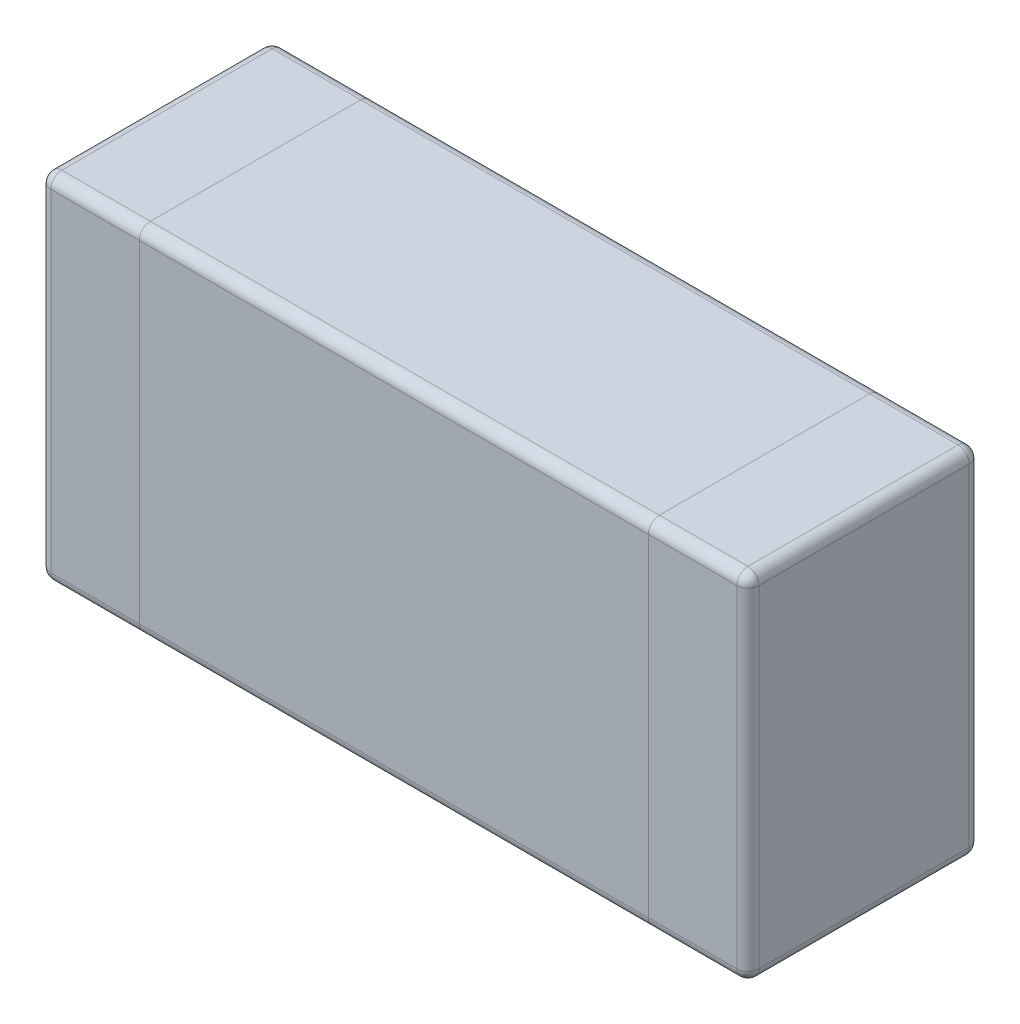
ISO-10303-21;
HEADER;
FILE_DESCRIPTION(('STEP AP214'),'2;1');
FILE_NAME('part.step','',(''),(''),'','','');
FILE_SCHEMA(('AUTOMOTIVE_DESIGN { 1 0 10303 214 1 1 1 1 }'));
ENDSEC;
DATA;
#1=APPLICATION_CONTEXT('core data for automotive mechanical design processes');
#2=APPLICATION_PROTOCOL_DEFINITION('international standard','automotive_design',2000,#1);
#3=PRODUCT_CONTEXT('',#1,'mechanical');
#4=PRODUCT('Part','Part','',(#3));
#5=PRODUCT_RELATED_PRODUCT_CATEGORY('part','',(#4));
#6=PRODUCT_DEFINITION_FORMATION('','',#4);
#7=PRODUCT_DEFINITION_CONTEXT('part definition',#1,'design');
#8=PRODUCT_DEFINITION('design','',#6,#7);
#9=PRODUCT_DEFINITION_SHAPE('','',#8);
#10=(LENGTH_UNIT() NAMED_UNIT(*) SI_UNIT(.MILLI.,.METRE.));
#11=(NAMED_UNIT(*) PLANE_ANGLE_UNIT() SI_UNIT($,.RADIAN.));
#12=(NAMED_UNIT(*) SI_UNIT($,.STERADIAN.) SOLID_ANGLE_UNIT());
#13=UNCERTAINTY_MEASURE_WITH_UNIT(LENGTH_MEASURE(1.E-05),#10,'distance_accuracy_value','');
#14=(GEOMETRIC_REPRESENTATION_CONTEXT(3) GLOBAL_UNCERTAINTY_ASSIGNED_CONTEXT((#13)) GLOBAL_UNIT_ASSIGNED_CONTEXT((#10,
#11,#12)) REPRESENTATION_CONTEXT('',''));
#15=CARTESIAN_POINT('',(0.,0.,0.));
#16=DIRECTION('',(0.,0.,1.));
#17=DIRECTION('',(1.,0.,0.));
#18=AXIS2_PLACEMENT_3D('',#15,#16,#17);
#19=CARTESIAN_POINT('',(1.6,0.799999999999718,1.05000000000022));
#20=DIRECTION('',(0.,2.68736422004423E-13,-1.));
#21=DIRECTION('',(0.,1.,2.68736422004423E-13));
#22=AXIS2_PLACEMENT_3D('',#19,#20,#21);
#23=PLANE('',#22);
#24=DIRECTION('',(0.,-1.,-2.68736422004423E-13));
#25=VECTOR('',#24,1.);
#26=CARTESIAN_POINT('',(-1.15,0.799999999999718,1.05000000000022));
#27=LINE('',#26,#25);
#28=CARTESIAN_POINT('',(-1.15,0.749999999999718,1.0500000000002));
#29=VERTEX_POINT('',#28);
#30=CARTESIAN_POINT('',(-1.15,-0.750000000000283,1.0499999999998));
#31=VERTEX_POINT('',#30);
#32=EDGE_CURVE('E11',#29,#31,#27,.T.);
#33=ORIENTED_EDGE('',*,*,#32,.F.);
#34=DIRECTION('',(-1.,0.,0.));
#35=VECTOR('',#34,1.);
#36=CARTESIAN_POINT('',(1.6,0.749999999999718,1.0500000000002));
#37=LINE('',#36,#35);
#38=CARTESIAN_POINT('',(-1.55,0.749999999999718,1.0500000000002));
#39=VERTEX_POINT('',#38);
#40=EDGE_CURVE('E258',#29,#39,#37,.T.);
#41=ORIENTED_EDGE('',*,*,#40,.T.);
#42=DIRECTION('',(0.,-1.,-2.68736422004423E-13));
#43=VECTOR('',#42,1.);
#44=CARTESIAN_POINT('',(-1.55,0.799999999999718,1.05000000000022));
#45=LINE('',#44,#43);
#46=CARTESIAN_POINT('',(-1.55,-0.750000000000283,1.0499999999998));
#47=VERTEX_POINT('',#46);
#48=EDGE_CURVE('E261',#39,#47,#45,.T.);
#49=ORIENTED_EDGE('',*,*,#48,.T.);
#50=DIRECTION('',(1.,0.,0.));
#51=VECTOR('',#50,1.);
#52=CARTESIAN_POINT('',(1.6,-0.750000000000283,1.0499999999998));
#53=LINE('',#52,#51);
#54=EDGE_CURVE('E265',#47,#31,#53,.T.);
#55=ORIENTED_EDGE('',*,*,#54,.T.);
#56=EDGE_LOOP('',(#33,#41,#49,#55));
#57=FACE_BOUND('',#56,.T.);
#58=ADVANCED_FACE('F42',(#57),#23,.F.);
#59=DIRECTION('',(0.,1.,2.68736422004423E-13));
#60=VECTOR('',#59,1.);
#61=CARTESIAN_POINT('',(1.15,0.799999999999718,1.05000000000022));
#62=LINE('',#61,#60);
#63=CARTESIAN_POINT('',(1.15,-0.750000000000283,1.0499999999998));
#64=VERTEX_POINT('',#63);
#65=CARTESIAN_POINT('',(1.15,0.749999999999718,1.0500000000002));
#66=VERTEX_POINT('',#65);
#67=EDGE_CURVE('E52',#64,#66,#62,.T.);
#68=ORIENTED_EDGE('',*,*,#67,.F.);
#69=CARTESIAN_POINT('',(1.55,-0.750000000000283,1.0499999999998));
#70=VERTEX_POINT('',#69);
#71=EDGE_CURVE('E264',#64,#70,#53,.T.);
#72=ORIENTED_EDGE('',*,*,#71,.T.);
#73=DIRECTION('',(0.,1.,2.68736422004423E-13));
#74=VECTOR('',#73,1.);
#75=CARTESIAN_POINT('',(1.55,0.799999999999718,1.05000000000022));
#76=LINE('',#75,#74);
#77=CARTESIAN_POINT('',(1.55,0.749999999999718,1.0500000000002));
#78=VERTEX_POINT('',#77);
#79=EDGE_CURVE('E255',#70,#78,#76,.T.);
#80=ORIENTED_EDGE('',*,*,#79,.T.);
#81=EDGE_CURVE('E259',#78,#66,#37,.T.);
#82=ORIENTED_EDGE('',*,*,#81,.T.);
#83=EDGE_LOOP('',(#68,#72,#80,#82));
#84=FACE_BOUND('',#83,.T.);
#85=ADVANCED_FACE('F531',(#84),#23,.F.);
#86=CARTESIAN_POINT('',(1.6,-0.750000000000269,0.999999999999799));
#87=DIRECTION('',(1.,0.,0.));
#88=DIRECTION('',(0.,1.,2.68736422004423E-13));
#89=AXIS2_PLACEMENT_3D('',#86,#87,#88);
#90=CYLINDRICAL_SURFACE('',#89,0.05);
#91=DIRECTION('',(1.,0.,0.));
#92=VECTOR('',#91,1.);
#93=CARTESIAN_POINT('',(-1.6,-0.800000000000269,0.999999999999786));
#94=LINE('',#93,#92);
#95=CARTESIAN_POINT('',(-1.15,-0.800000000000269,0.999999999999786));
#96=VERTEX_POINT('',#95);
#97=CARTESIAN_POINT('',(-1.55,-0.800000000000269,0.999999999999786));
#98=VERTEX_POINT('',#97);
#99=EDGE_CURVE('E251',#96,#98,#94,.F.);
#100=ORIENTED_EDGE('',*,*,#99,.F.);
#101=CARTESIAN_POINT('',(-1.15,-0.750000000000269,0.999999999999799));
#102=DIRECTION('',(1.,0.,0.));
#103=DIRECTION('',(0.,1.,2.68736422004423E-13));
#104=AXIS2_PLACEMENT_3D('',#101,#102,#103);
#105=CIRCLE('',#104,0.05);
#106=EDGE_CURVE('E359',#96,#31,#105,.F.);
#107=ORIENTED_EDGE('',*,*,#106,.T.);
#108=ORIENTED_EDGE('',*,*,#54,.F.);
#109=CARTESIAN_POINT('',(-1.55,-0.750000000000269,0.999999999999799));
#110=DIRECTION('',(-1.,0.,0.));
#111=DIRECTION('',(0.,2.68736422004423E-13,-1.));
#112=AXIS2_PLACEMENT_3D('',#109,#110,#111);
#113=CIRCLE('',#112,0.05);
#114=EDGE_CURVE('E335',#47,#98,#113,.F.);
#115=ORIENTED_EDGE('',*,*,#114,.T.);
#116=EDGE_LOOP('',(#100,#107,#108,#115));
#117=FACE_BOUND('',#116,.T.);
#118=ADVANCED_FACE('F488',(#117),#90,.T.);
#119=ORIENTED_EDGE('',*,*,#71,.F.);
#120=CARTESIAN_POINT('',(1.15,-0.750000000000269,0.999999999999799));
#121=DIRECTION('',(-1.,0.,0.));
#122=DIRECTION('',(0.,-1.,-2.68736422004423E-13));
#123=AXIS2_PLACEMENT_3D('',#120,#121,#122);
#124=CIRCLE('',#123,0.05);
#125=CARTESIAN_POINT('',(1.15,-0.800000000000269,0.999999999999786));
#126=VERTEX_POINT('',#125);
#127=EDGE_CURVE('E358',#64,#126,#124,.F.);
#128=ORIENTED_EDGE('',*,*,#127,.T.);
#129=CARTESIAN_POINT('',(1.55,-0.800000000000269,0.999999999999786));
#130=VERTEX_POINT('',#129);
#131=EDGE_CURVE('E252',#130,#126,#94,.F.);
#132=ORIENTED_EDGE('',*,*,#131,.F.);
#133=CARTESIAN_POINT('',(1.55,-0.750000000000269,0.999999999999799));
#134=DIRECTION('',(1.,0.,0.));
#135=DIRECTION('',(0.,1.,2.68736422004423E-13));
#136=AXIS2_PLACEMENT_3D('',#133,#134,#135);
#137=CIRCLE('',#136,0.05);
#138=EDGE_CURVE('E320',#70,#130,#137,.T.);
#139=ORIENTED_EDGE('',*,*,#138,.F.);
#140=EDGE_LOOP('',(#119,#128,#132,#139));
#141=FACE_BOUND('',#140,.T.);
#142=ADVANCED_FACE('F462',(#141),#90,.T.);
#143=CARTESIAN_POINT('',(-1.6,-0.800000000000282,1.04999999999979));
#144=DIRECTION('',(0.,1.,2.68736422004423E-13));
#145=DIRECTION('',(-1.,0.,0.));
#146=AXIS2_PLACEMENT_3D('',#143,#144,#145);
#147=PLANE('',#146);
#148=DIRECTION('',(0.,2.68736422004423E-13,-1.));
#149=VECTOR('',#148,1.);
#150=CARTESIAN_POINT('',(-1.15,-0.800000000000282,1.04999999999979));
#151=LINE('',#150,#149);
#152=CARTESIAN_POINT('',(-1.15,-0.800000000000014,0.0499999999997849));
#153=VERTEX_POINT('',#152);
#154=EDGE_CURVE('E354',#96,#153,#151,.T.);
#155=ORIENTED_EDGE('',*,*,#154,.F.);
#156=ORIENTED_EDGE('',*,*,#99,.T.);
#157=DIRECTION('',(0.,2.68736422004423E-13,-1.));
#158=VECTOR('',#157,1.);
#159=CARTESIAN_POINT('',(-1.55,-0.800000000000282,1.04999999999979));
#160=LINE('',#159,#158);
#161=CARTESIAN_POINT('',(-1.55,-0.800000000000014,0.0499999999997849));
#162=VERTEX_POINT('',#161);
#163=EDGE_CURVE('E248',#98,#162,#160,.T.);
#164=ORIENTED_EDGE('',*,*,#163,.T.);
#165=DIRECTION('',(1.,0.,0.));
#166=VECTOR('',#165,1.);
#167=CARTESIAN_POINT('',(1.6,-0.800000000000014,0.0499999999997849));
#168=LINE('',#167,#166);
#169=EDGE_CURVE('E242',#162,#153,#168,.T.);
#170=ORIENTED_EDGE('',*,*,#169,.T.);
#171=EDGE_LOOP('',(#155,#156,#164,#170));
#172=FACE_BOUND('',#171,.T.);
#173=ADVANCED_FACE('F476',(#172),#147,.F.);
#174=DIRECTION('',(0.,-2.68736422004423E-13,1.));
#175=VECTOR('',#174,1.);
#176=CARTESIAN_POINT('',(1.15,-0.800000000000282,1.04999999999979));
#177=LINE('',#176,#175);
#178=CARTESIAN_POINT('',(1.15,-0.800000000000014,0.0499999999997849));
#179=VERTEX_POINT('',#178);
#180=EDGE_CURVE('E350',#179,#126,#177,.T.);
#181=ORIENTED_EDGE('',*,*,#180,.F.);
#182=CARTESIAN_POINT('',(1.55,-0.800000000000014,0.0499999999997849));
#183=VERTEX_POINT('',#182);
#184=EDGE_CURVE('E241',#179,#183,#168,.T.);
#185=ORIENTED_EDGE('',*,*,#184,.T.);
#186=DIRECTION('',(0.,2.68736422004423E-13,-1.));
#187=VECTOR('',#186,1.);
#188=CARTESIAN_POINT('',(1.55,-0.800000000000282,1.04999999999979));
#189=LINE('',#188,#187);
#190=EDGE_CURVE('E245',#183,#130,#189,.F.);
#191=ORIENTED_EDGE('',*,*,#190,.T.);
#192=ORIENTED_EDGE('',*,*,#131,.T.);
#193=EDGE_LOOP('',(#181,#185,#191,#192));
#194=FACE_BOUND('',#193,.T.);
#195=ADVANCED_FACE('F458',(#194),#147,.F.);
#196=CARTESIAN_POINT('',(-1.6,-0.750000000000014,0.0499999999997984));
#197=DIRECTION('',(-1.,0.,0.));
#198=DIRECTION('',(0.,-1.,-2.68736422004423E-13));
#199=AXIS2_PLACEMENT_3D('',#196,#197,#198);
#200=CYLINDRICAL_SURFACE('',#199,0.05);
#201=DIRECTION('',(1.,0.,0.));
#202=VECTOR('',#201,1.);
#203=CARTESIAN_POINT('',(-1.6,-0.75,-2.01552316503317E-13));
#204=LINE('',#203,#202);
#205=CARTESIAN_POINT('',(-1.15,-0.75,-2.01552316503317E-13));
#206=VERTEX_POINT('',#205);
#207=CARTESIAN_POINT('',(-1.55,-0.75,-2.01552316503317E-13));
#208=VERTEX_POINT('',#207);
#209=EDGE_CURVE('E271',#206,#208,#204,.F.);
#210=ORIENTED_EDGE('',*,*,#209,.F.);
#211=CARTESIAN_POINT('',(-1.15,-0.750000000000014,0.0499999999997984));
#212=DIRECTION('',(1.,0.,0.));
#213=DIRECTION('',(0.,1.,2.68736422004423E-13));
#214=AXIS2_PLACEMENT_3D('',#211,#212,#213);
#215=CIRCLE('',#214,0.05);
#216=EDGE_CURVE('E355',#206,#153,#215,.F.);
#217=ORIENTED_EDGE('',*,*,#216,.T.);
#218=ORIENTED_EDGE('',*,*,#169,.F.);
#219=CARTESIAN_POINT('',(-1.55,-0.750000000000014,0.0499999999997985));
#220=DIRECTION('',(-1.,0.,0.));
#221=DIRECTION('',(0.,-1.,-2.68736422004423E-13));
#222=AXIS2_PLACEMENT_3D('',#219,#220,#221);
#223=CIRCLE('',#222,0.05);
#224=EDGE_CURVE('E326',#162,#208,#223,.F.);
#225=ORIENTED_EDGE('',*,*,#224,.T.);
#226=EDGE_LOOP('',(#210,#217,#218,#225));
#227=FACE_BOUND('',#226,.T.);
#228=ADVANCED_FACE('F514',(#227),#200,.T.);
#229=ORIENTED_EDGE('',*,*,#184,.F.);
#230=CARTESIAN_POINT('',(1.15,-0.750000000000014,0.0499999999997984));
#231=DIRECTION('',(-1.,0.,0.));
#232=DIRECTION('',(0.,-1.,-2.68736422004423E-13));
#233=AXIS2_PLACEMENT_3D('',#230,#231,#232);
#234=CIRCLE('',#233,0.05);
#235=CARTESIAN_POINT('',(1.15,-0.75,-2.01552316503317E-13));
#236=VERTEX_POINT('',#235);
#237=EDGE_CURVE('E370',#179,#236,#234,.F.);
#238=ORIENTED_EDGE('',*,*,#237,.T.);
#239=CARTESIAN_POINT('',(1.55,-0.75,-2.01552316503317E-13));
#240=VERTEX_POINT('',#239);
#241=EDGE_CURVE('E272',#240,#236,#204,.F.);
#242=ORIENTED_EDGE('',*,*,#241,.F.);
#243=CARTESIAN_POINT('',(1.55,-0.750000000000014,0.0499999999997984));
#244=DIRECTION('',(1.,0.,0.));
#245=DIRECTION('',(0.,1.,2.68736422004423E-13));
#246=AXIS2_PLACEMENT_3D('',#243,#244,#245);
#247=CIRCLE('',#246,0.05);
#248=EDGE_CURVE('E306',#183,#240,#247,.T.);
#249=ORIENTED_EDGE('',*,*,#248,.F.);
#250=EDGE_LOOP('',(#229,#238,#242,#249));
#251=FACE_BOUND('',#250,.T.);
#252=ADVANCED_FACE('F448',(#251),#200,.T.);
#253=CARTESIAN_POINT('',(1.6,0.8,2.14989137603538E-13));
#254=DIRECTION('',(0.,2.68736422004423E-13,-1.));
#255=DIRECTION('',(0.,1.,2.68736422004423E-13));
#256=AXIS2_PLACEMENT_3D('',#253,#254,#255);
#257=PLANE('',#256);
#258=DIRECTION('',(-1.,0.,0.));
#259=VECTOR('',#258,1.);
#260=CARTESIAN_POINT('',(1.6,0.75,2.01552316503317E-13));
#261=LINE('',#260,#259);
#262=CARTESIAN_POINT('',(-1.55,0.75,2.01552316503317E-13));
#263=VERTEX_POINT('',#262);
#264=CARTESIAN_POINT('',(-1.15,0.75,2.01552316503317E-13));
#265=VERTEX_POINT('',#264);
#266=EDGE_CURVE('E279',#263,#265,#261,.F.);
#267=ORIENTED_EDGE('',*,*,#266,.T.);
#268=DIRECTION('',(0.,-1.,-2.68736422004423E-13));
#269=VECTOR('',#268,1.);
#270=CARTESIAN_POINT('',(-1.15,0.8,2.14989137603538E-13));
#271=LINE('',#270,#269);
#272=EDGE_CURVE('E371',#265,#206,#271,.T.);
#273=ORIENTED_EDGE('',*,*,#272,.T.);
#274=ORIENTED_EDGE('',*,*,#209,.T.);
#275=DIRECTION('',(0.,-1.,-2.68736422004423E-13));
#276=VECTOR('',#275,1.);
#277=CARTESIAN_POINT('',(-1.55,0.8,2.14989137603538E-13));
#278=LINE('',#277,#276);
#279=EDGE_CURVE('E275',#208,#263,#278,.F.);
#280=ORIENTED_EDGE('',*,*,#279,.T.);
#281=EDGE_LOOP('',(#267,#273,#274,#280));
#282=FACE_BOUND('',#281,.T.);
#283=ADVANCED_FACE('F517',(#282),#257,.T.);
#284=ORIENTED_EDGE('',*,*,#241,.T.);
#285=DIRECTION('',(0.,1.,2.68736422004423E-13));
#286=VECTOR('',#285,1.);
#287=CARTESIAN_POINT('',(1.15,0.8,2.14989137603538E-13));
#288=LINE('',#287,#286);
#289=CARTESIAN_POINT('',(1.15,0.75,2.01552316503317E-13));
#290=VERTEX_POINT('',#289);
#291=EDGE_CURVE('E365',#236,#290,#288,.T.);
#292=ORIENTED_EDGE('',*,*,#291,.T.);
#293=CARTESIAN_POINT('',(1.55,0.75,2.01552316503317E-13));
#294=VERTEX_POINT('',#293);
#295=EDGE_CURVE('E278',#290,#294,#261,.F.);
#296=ORIENTED_EDGE('',*,*,#295,.T.);
#297=DIRECTION('',(0.,1.,2.68736422004423E-13));
#298=VECTOR('',#297,1.);
#299=CARTESIAN_POINT('',(1.55,-0.8,-2.14989137603538E-13));
#300=LINE('',#299,#298);
#301=EDGE_CURVE('E268',#294,#240,#300,.F.);
#302=ORIENTED_EDGE('',*,*,#301,.T.);
#303=EDGE_LOOP('',(#284,#292,#296,#302));
#304=FACE_BOUND('',#303,.T.);
#305=ADVANCED_FACE('F393',(#304),#257,.T.);
#306=CARTESIAN_POINT('',(1.6,0.749999999999731,1.0000000000002));
#307=DIRECTION('',(-1.,0.,0.));
#308=DIRECTION('',(0.,-1.,-2.68736422004423E-13));
#309=AXIS2_PLACEMENT_3D('',#306,#307,#308);
#310=CYLINDRICAL_SURFACE('',#309,0.05);
#311=ORIENTED_EDGE('',*,*,#40,.F.);
#312=CARTESIAN_POINT('',(-1.15,0.749999999999731,1.0000000000002));
#313=DIRECTION('',(1.,0.,0.));
#314=DIRECTION('',(0.,1.,2.68736422004423E-13));
#315=AXIS2_PLACEMENT_3D('',#312,#313,#314);
#316=CIRCLE('',#315,0.05);
#317=CARTESIAN_POINT('',(-1.15,0.799999999999731,1.00000000000022));
#318=VERTEX_POINT('',#317);
#319=EDGE_CURVE('E362',#29,#318,#316,.F.);
#320=ORIENTED_EDGE('',*,*,#319,.T.);
#321=DIRECTION('',(-1.,0.,0.));
#322=VECTOR('',#321,1.);
#323=CARTESIAN_POINT('',(-1.6,0.799999999999731,1.00000000000022));
#324=LINE('',#323,#322);
#325=CARTESIAN_POINT('',(-1.55,0.799999999999731,1.00000000000022));
#326=VERTEX_POINT('',#325);
#327=EDGE_CURVE('E221',#326,#318,#324,.F.);
#328=ORIENTED_EDGE('',*,*,#327,.F.);
#329=CARTESIAN_POINT('',(-1.55,0.749999999999731,1.0000000000002));
#330=DIRECTION('',(-1.,0.,0.));
#331=DIRECTION('',(0.,-1.,-2.68736422004423E-13));
#332=AXIS2_PLACEMENT_3D('',#329,#330,#331);
#333=CIRCLE('',#332,0.05);
#334=EDGE_CURVE('E297',#326,#39,#333,.F.);
#335=ORIENTED_EDGE('',*,*,#334,.T.);
#336=EDGE_LOOP('',(#311,#320,#328,#335));
#337=FACE_BOUND('',#336,.T.);
#338=ADVANCED_FACE('F524',(#337),#310,.T.);
#339=CARTESIAN_POINT('',(1.15,0.799999999999731,1.00000000000022));
#340=VERTEX_POINT('',#339);
#341=CARTESIAN_POINT('',(1.55,0.799999999999731,1.00000000000022));
#342=VERTEX_POINT('',#341);
#343=EDGE_CURVE('E216',#340,#342,#324,.F.);
#344=ORIENTED_EDGE('',*,*,#343,.F.);
#345=CARTESIAN_POINT('',(1.15,0.749999999999731,1.0000000000002));
#346=DIRECTION('',(-1.,0.,0.));
#347=DIRECTION('',(0.,-1.,-2.68736422004423E-13));
#348=AXIS2_PLACEMENT_3D('',#345,#346,#347);
#349=CIRCLE('',#348,0.05);
#350=EDGE_CURVE('E366',#340,#66,#349,.F.);
#351=ORIENTED_EDGE('',*,*,#350,.T.);
#352=ORIENTED_EDGE('',*,*,#81,.F.);
#353=CARTESIAN_POINT('',(1.55,0.749999999999731,1.0000000000002));
#354=DIRECTION('',(1.,0.,0.));
#355=DIRECTION('',(0.,-2.68736422004423E-13,1.));
#356=AXIS2_PLACEMENT_3D('',#353,#354,#355);
#357=CIRCLE('',#356,0.05);
#358=EDGE_CURVE('E201',#342,#78,#357,.T.);
#359=ORIENTED_EDGE('',*,*,#358,.F.);
#360=EDGE_LOOP('',(#344,#351,#352,#359));
#361=FACE_BOUND('',#360,.T.);
#362=ADVANCED_FACE('F427',(#361),#310,.T.);
#363=CARTESIAN_POINT('',(-1.6,0.749999999999987,0.0500000000002015));
#364=DIRECTION('',(1.,0.,0.));
#365=DIRECTION('',(0.,1.,2.68736422004423E-13));
#366=AXIS2_PLACEMENT_3D('',#363,#364,#365);
#367=CYLINDRICAL_SURFACE('',#366,0.05);
#368=DIRECTION('',(-1.,0.,0.));
#369=VECTOR('',#368,1.);
#370=CARTESIAN_POINT('',(-1.6,0.799999999999987,0.0500000000002149));
#371=LINE('',#370,#369);
#372=CARTESIAN_POINT('',(-1.15,0.799999999999987,0.0500000000002149));
#373=VERTEX_POINT('',#372);
#374=CARTESIAN_POINT('',(-1.55,0.799999999999987,0.0500000000002149));
#375=VERTEX_POINT('',#374);
#376=EDGE_CURVE('E213',#373,#375,#371,.T.);
#377=ORIENTED_EDGE('',*,*,#376,.F.);
#378=CARTESIAN_POINT('',(-1.15,0.749999999999987,0.0500000000002015));
#379=DIRECTION('',(1.,0.,0.));
#380=DIRECTION('',(0.,1.,2.68736422004423E-13));
#381=AXIS2_PLACEMENT_3D('',#378,#379,#380);
#382=CIRCLE('',#381,0.05);
#383=EDGE_CURVE('E375',#373,#265,#382,.F.);
#384=ORIENTED_EDGE('',*,*,#383,.T.);
#385=ORIENTED_EDGE('',*,*,#266,.F.);
#386=CARTESIAN_POINT('',(-1.55,0.749999999999987,0.0500000000002015));
#387=DIRECTION('',(-1.,0.,0.));
#388=DIRECTION('',(0.,-1.,-2.68736422004423E-13));
#389=AXIS2_PLACEMENT_3D('',#386,#387,#388);
#390=CIRCLE('',#389,0.05);
#391=EDGE_CURVE('E294',#263,#375,#390,.F.);
#392=ORIENTED_EDGE('',*,*,#391,.T.);
#393=EDGE_LOOP('',(#377,#384,#385,#392));
#394=FACE_BOUND('',#393,.T.);
#395=ADVANCED_FACE('F410',(#394),#367,.T.);
#396=ORIENTED_EDGE('',*,*,#295,.F.);
#397=CARTESIAN_POINT('',(1.15,0.749999999999987,0.0500000000002015));
#398=DIRECTION('',(-1.,0.,0.));
#399=DIRECTION('',(0.,-1.,-2.68736422004423E-13));
#400=AXIS2_PLACEMENT_3D('',#397,#398,#399);
#401=CIRCLE('',#400,0.05);
#402=CARTESIAN_POINT('',(1.15,0.799999999999987,0.0500000000002149));
#403=VERTEX_POINT('',#402);
#404=EDGE_CURVE('E46',#290,#403,#401,.F.);
#405=ORIENTED_EDGE('',*,*,#404,.T.);
#406=CARTESIAN_POINT('',(1.55,0.799999999999987,0.0500000000002149));
#407=VERTEX_POINT('',#406);
#408=EDGE_CURVE('E204',#407,#403,#371,.T.);
#409=ORIENTED_EDGE('',*,*,#408,.F.);
#410=CARTESIAN_POINT('',(1.55,0.749999999999987,0.0500000000002016));
#411=DIRECTION('',(1.,0.,0.));
#412=DIRECTION('',(0.,1.,2.68736422004423E-13));
#413=AXIS2_PLACEMENT_3D('',#410,#411,#412);
#414=CIRCLE('',#413,0.05);
#415=EDGE_CURVE('E193',#294,#407,#414,.T.);
#416=ORIENTED_EDGE('',*,*,#415,.F.);
#417=EDGE_LOOP('',(#396,#405,#409,#416));
#418=FACE_BOUND('',#417,.T.);
#419=ADVANCED_FACE('F205',(#418),#367,.T.);
#420=CARTESIAN_POINT('',(-1.6,0.799999999999718,1.05000000000022));
#421=DIRECTION('',(0.,-1.,-2.68736422004423E-13));
#422=DIRECTION('',(1.,0.,0.));
#423=AXIS2_PLACEMENT_3D('',#420,#421,#422);
#424=PLANE('',#423);
#425=DIRECTION('',(0.,-2.68736422004423E-13,1.));
#426=VECTOR('',#425,1.);
#427=CARTESIAN_POINT('',(-1.15,0.799999999999718,1.05000000000022));
#428=LINE('',#427,#426);
#429=EDGE_CURVE('E346',#373,#318,#428,.T.);
#430=ORIENTED_EDGE('',*,*,#429,.F.);
#431=ORIENTED_EDGE('',*,*,#376,.T.);
#432=DIRECTION('',(0.,2.68736422004423E-13,-1.));
#433=VECTOR('',#432,1.);
#434=CARTESIAN_POINT('',(-1.55,0.799999999999718,1.05000000000022));
#435=LINE('',#434,#433);
#436=EDGE_CURVE('E210',#375,#326,#435,.F.);
#437=ORIENTED_EDGE('',*,*,#436,.T.);
#438=ORIENTED_EDGE('',*,*,#327,.T.);
#439=EDGE_LOOP('',(#430,#431,#437,#438));
#440=FACE_BOUND('',#439,.T.);
#441=ADVANCED_FACE('F413',(#440),#424,.F.);
#442=DIRECTION('',(0.,2.68736422004423E-13,-1.));
#443=VECTOR('',#442,1.);
#444=CARTESIAN_POINT('',(1.15,0.799999999999718,1.05000000000022));
#445=LINE('',#444,#443);
#446=EDGE_CURVE('E281',#340,#403,#445,.T.);
#447=ORIENTED_EDGE('',*,*,#446,.F.);
#448=ORIENTED_EDGE('',*,*,#343,.T.);
#449=DIRECTION('',(0.,2.68736422004423E-13,-1.));
#450=VECTOR('',#449,1.);
#451=CARTESIAN_POINT('',(1.55,0.799999999999718,1.05000000000022));
#452=LINE('',#451,#450);
#453=EDGE_CURVE('E185',#342,#407,#452,.T.);
#454=ORIENTED_EDGE('',*,*,#453,.T.);
#455=ORIENTED_EDGE('',*,*,#408,.T.);
#456=EDGE_LOOP('',(#447,#448,#454,#455));
#457=FACE_BOUND('',#456,.T.);
#458=ADVANCED_FACE('F214',(#457),#424,.F.);
#459=CARTESIAN_POINT('',(1.6,-0.800000000000282,1.04999999999979));
#460=DIRECTION('',(-1.,0.,0.));
#461=DIRECTION('',(0.,-1.,-2.68736422004423E-13));
#462=AXIS2_PLACEMENT_3D('',#459,#460,#461);
#463=PLANE('',#462);
#464=DIRECTION('',(0.,2.68736422004423E-13,-1.));
#465=VECTOR('',#464,1.);
#466=CARTESIAN_POINT('',(1.6,0.749999999999718,1.0500000000002));
#467=LINE('',#466,#465);
#468=CARTESIAN_POINT('',(1.6,0.749999999999987,0.0500000000002015));
#469=VERTEX_POINT('',#468);
#470=CARTESIAN_POINT('',(1.6,0.749999999999731,1.0000000000002));
#471=VERTEX_POINT('',#470);
#472=EDGE_CURVE('E187',#469,#471,#467,.F.);
#473=ORIENTED_EDGE('',*,*,#472,.T.);
#474=DIRECTION('',(0.,1.,2.68736422004423E-13));
#475=VECTOR('',#474,1.);
#476=CARTESIAN_POINT('',(1.6,-0.800000000000269,0.999999999999786));
#477=LINE('',#476,#475);
#478=CARTESIAN_POINT('',(1.6,-0.750000000000269,0.999999999999799));
#479=VERTEX_POINT('',#478);
#480=EDGE_CURVE('E230',#471,#479,#477,.F.);
#481=ORIENTED_EDGE('',*,*,#480,.T.);
#482=DIRECTION('',(0.,2.68736422004423E-13,-1.));
#483=VECTOR('',#482,1.);
#484=CARTESIAN_POINT('',(1.6,-0.750000000000282,1.0499999999998));
#485=LINE('',#484,#483);
#486=CARTESIAN_POINT('',(1.6,-0.750000000000014,0.0499999999997984));
#487=VERTEX_POINT('',#486);
#488=EDGE_CURVE('E227',#479,#487,#485,.T.);
#489=ORIENTED_EDGE('',*,*,#488,.T.);
#490=DIRECTION('',(0.,1.,2.68736422004423E-13));
#491=VECTOR('',#490,1.);
#492=CARTESIAN_POINT('',(1.6,0.799999999999987,0.0500000000002149));
#493=LINE('',#492,#491);
#494=EDGE_CURVE('E225',#487,#469,#493,.T.);
#495=ORIENTED_EDGE('',*,*,#494,.T.);
#496=EDGE_LOOP('',(#473,#481,#489,#495));
#497=FACE_BOUND('',#496,.T.);
#498=ADVANCED_FACE('F439',(#497),#463,.F.);
#499=EDGE_CURVE('E211',#403,#373,#371,.T.);
#500=ORIENTED_EDGE('',*,*,#499,.T.);
#501=ORIENTED_EDGE('',*,*,#429,.T.);
#502=EDGE_CURVE('E219',#318,#340,#324,.F.);
#503=ORIENTED_EDGE('',*,*,#502,.T.);
#504=ORIENTED_EDGE('',*,*,#446,.T.);
#505=EDGE_LOOP('',(#500,#501,#503,#504));
#506=FACE_BOUND('',#505,.T.);
#507=ADVANCED_FACE('F419',(#506),#424,.F.);
#508=CARTESIAN_POINT('',(-1.6,-0.800000000000282,1.04999999999979));
#509=DIRECTION('',(1.,0.,0.));
#510=DIRECTION('',(0.,1.,2.68736422004423E-13));
#511=AXIS2_PLACEMENT_3D('',#508,#509,#510);
#512=PLANE('',#511);
#513=DIRECTION('',(0.,2.68736422004423E-13,-1.));
#514=VECTOR('',#513,1.);
#515=CARTESIAN_POINT('',(-1.6,-0.750000000000282,1.0499999999998));
#516=LINE('',#515,#514);
#517=CARTESIAN_POINT('',(-1.6,-0.750000000000014,0.0499999999997984));
#518=VERTEX_POINT('',#517);
#519=CARTESIAN_POINT('',(-1.6,-0.750000000000269,0.999999999999799));
#520=VERTEX_POINT('',#519);
#521=EDGE_CURVE('E234',#518,#520,#516,.F.);
#522=ORIENTED_EDGE('',*,*,#521,.T.);
#523=DIRECTION('',(0.,-1.,-2.68736422004423E-13));
#524=VECTOR('',#523,1.);
#525=CARTESIAN_POINT('',(-1.6,-0.800000000000269,0.999999999999786));
#526=LINE('',#525,#524);
#527=CARTESIAN_POINT('',(-1.6,0.749999999999732,1.0000000000002));
#528=VERTEX_POINT('',#527);
#529=EDGE_CURVE('E239',#520,#528,#526,.F.);
#530=ORIENTED_EDGE('',*,*,#529,.T.);
#531=DIRECTION('',(0.,2.68736422004423E-13,-1.));
#532=VECTOR('',#531,1.);
#533=CARTESIAN_POINT('',(-1.6,0.749999999999718,1.0500000000002));
#534=LINE('',#533,#532);
#535=CARTESIAN_POINT('',(-1.6,0.749999999999987,0.0500000000002015));
#536=VERTEX_POINT('',#535);
#537=EDGE_CURVE('E236',#528,#536,#534,.T.);
#538=ORIENTED_EDGE('',*,*,#537,.T.);
#539=DIRECTION('',(0.,-1.,-2.68736422004423E-13));
#540=VECTOR('',#539,1.);
#541=CARTESIAN_POINT('',(-1.6,-0.800000000000014,0.0499999999997849));
#542=LINE('',#541,#540);
#543=EDGE_CURVE('E232',#536,#518,#542,.T.);
#544=ORIENTED_EDGE('',*,*,#543,.T.);
#545=EDGE_LOOP('',(#522,#530,#538,#544));
#546=FACE_BOUND('',#545,.T.);
#547=ADVANCED_FACE('F496',(#546),#512,.F.);
#548=EDGE_CURVE('E256',#126,#96,#94,.F.);
#549=ORIENTED_EDGE('',*,*,#548,.T.);
#550=ORIENTED_EDGE('',*,*,#154,.T.);
#551=EDGE_CURVE('E246',#153,#179,#168,.T.);
#552=ORIENTED_EDGE('',*,*,#551,.T.);
#553=ORIENTED_EDGE('',*,*,#180,.T.);
#554=EDGE_LOOP('',(#549,#550,#552,#553));
#555=FACE_BOUND('',#554,.T.);
#556=ADVANCED_FACE('F469',(#555),#147,.F.);
#557=EDGE_CURVE('E262',#66,#29,#37,.T.);
#558=ORIENTED_EDGE('',*,*,#557,.T.);
#559=ORIENTED_EDGE('',*,*,#32,.T.);
#560=EDGE_CURVE('E269',#31,#64,#53,.T.);
#561=ORIENTED_EDGE('',*,*,#560,.T.);
#562=ORIENTED_EDGE('',*,*,#67,.T.);
#563=EDGE_LOOP('',(#558,#559,#561,#562));
#564=FACE_BOUND('',#563,.T.);
#565=ADVANCED_FACE('F529',(#564),#23,.F.);
#566=ORIENTED_EDGE('',*,*,#272,.F.);
#567=EDGE_CURVE('E282',#265,#290,#261,.F.);
#568=ORIENTED_EDGE('',*,*,#567,.T.);
#569=ORIENTED_EDGE('',*,*,#291,.F.);
#570=EDGE_CURVE('E276',#236,#206,#204,.F.);
#571=ORIENTED_EDGE('',*,*,#570,.T.);
#572=EDGE_LOOP('',(#566,#568,#569,#571));
#573=FACE_BOUND('',#572,.T.);
#574=ADVANCED_FACE('F404',(#573),#257,.T.);
#575=CARTESIAN_POINT('',(-1.55,-0.750000000000282,1.0499999999998));
#576=DIRECTION('',(0.,2.68736422004423E-13,-1.));
#577=DIRECTION('',(0.,1.,2.68736422004423E-13));
#578=AXIS2_PLACEMENT_3D('',#575,#576,#577);
#579=CYLINDRICAL_SURFACE('',#578,0.05);
#580=CARTESIAN_POINT('',(-1.55,-0.750000000000269,0.999999999999799));
#581=DIRECTION('',(0.,-2.68736422004423E-13,1.));
#582=DIRECTION('',(0.,-1.,-2.68736422004423E-13));
#583=AXIS2_PLACEMENT_3D('',#580,#581,#582);
#584=CIRCLE('',#583,0.05);
#585=EDGE_CURVE('E341',#520,#98,#584,.T.);
#586=ORIENTED_EDGE('',*,*,#585,.F.);
#587=ORIENTED_EDGE('',*,*,#521,.F.);
#588=CARTESIAN_POINT('',(-1.55,-0.750000000000014,0.0499999999997984));
#589=DIRECTION('',(0.,2.68736422004423E-13,-1.));
#590=DIRECTION('',(0.,1.,2.68736422004423E-13));
#591=AXIS2_PLACEMENT_3D('',#588,#589,#590);
#592=CIRCLE('',#591,0.05);
#593=EDGE_CURVE('E338',#162,#518,#592,.T.);
#594=ORIENTED_EDGE('',*,*,#593,.F.);
#595=ORIENTED_EDGE('',*,*,#163,.F.);
#596=EDGE_LOOP('',(#586,#587,#594,#595));
#597=FACE_BOUND('',#596,.T.);
#598=ADVANCED_FACE('F44',(#597),#579,.T.);
#599=CARTESIAN_POINT('',(-1.55,-0.750000000000269,0.999999999999799));
#600=DIRECTION('',(0.,-1.,-2.68736422004423E-13));
#601=DIRECTION('',(1.,0.,0.));
#602=AXIS2_PLACEMENT_3D('',#599,#600,#601);
#603=SPHERICAL_SURFACE('',#602,0.05);
#604=CARTESIAN_POINT('',(-1.55,-0.750000000000269,0.999999999999799));
#605=DIRECTION('',(0.,-1.,-2.68736422004423E-13));
#606=DIRECTION('',(1.,0.,0.));
#607=AXIS2_PLACEMENT_3D('',#604,#605,#606);
#608=CIRCLE('',#607,0.05);
#609=EDGE_CURVE('E332',#520,#47,#608,.F.);
#610=ORIENTED_EDGE('',*,*,#609,.F.);
#611=ORIENTED_EDGE('',*,*,#585,.T.);
#612=ORIENTED_EDGE('',*,*,#114,.F.);
#613=EDGE_LOOP('',(#610,#611,#612));
#614=FACE_BOUND('',#613,.T.);
#615=ADVANCED_FACE('F485',(#614),#603,.T.);
#616=CARTESIAN_POINT('',(-1.55,-0.750000000000014,0.0499999999997985));
#617=DIRECTION('',(0.,-1.,-2.68736422004423E-13));
#618=DIRECTION('',(1.,0.,0.));
#619=AXIS2_PLACEMENT_3D('',#616,#617,#618);
#620=SPHERICAL_SURFACE('',#619,0.05);
#621=ORIENTED_EDGE('',*,*,#224,.F.);
#622=ORIENTED_EDGE('',*,*,#593,.T.);
#623=CARTESIAN_POINT('',(-1.55,-0.750000000000014,0.0499999999997984));
#624=DIRECTION('',(0.,-1.,-2.68736422004423E-13));
#625=DIRECTION('',(1.,0.,0.));
#626=AXIS2_PLACEMENT_3D('',#623,#624,#625);
#627=CIRCLE('',#626,0.05);
#628=EDGE_CURVE('E329',#208,#518,#627,.F.);
#629=ORIENTED_EDGE('',*,*,#628,.F.);
#630=EDGE_LOOP('',(#621,#622,#629));
#631=FACE_BOUND('',#630,.T.);
#632=ADVANCED_FACE('F512',(#631),#620,.T.);
#633=ORIENTED_EDGE('',*,*,#106,.F.);
#634=ORIENTED_EDGE('',*,*,#548,.F.);
#635=ORIENTED_EDGE('',*,*,#127,.F.);
#636=ORIENTED_EDGE('',*,*,#560,.F.);
#637=EDGE_LOOP('',(#633,#634,#635,#636));
#638=FACE_BOUND('',#637,.T.);
#639=ADVANCED_FACE('F471',(#638),#90,.T.);
#640=CARTESIAN_POINT('',(-1.55,0.799999999999731,1.00000000000022));
#641=DIRECTION('',(0.,-1.,-2.68736422004423E-13));
#642=DIRECTION('',(1.,0.,0.));
#643=AXIS2_PLACEMENT_3D('',#640,#641,#642);
#644=CYLINDRICAL_SURFACE('',#643,0.05);
#645=ORIENTED_EDGE('',*,*,#609,.T.);
#646=ORIENTED_EDGE('',*,*,#48,.F.);
#647=CARTESIAN_POINT('',(-1.55,0.749999999999732,1.0000000000002));
#648=DIRECTION('',(0.,1.,2.70904826349394E-13));
#649=DIRECTION('',(0.,-2.70904826349394E-13,1.));
#650=AXIS2_PLACEMENT_3D('',#647,#648,#649);
#651=CIRCLE('',#650,0.05);
#652=EDGE_CURVE('E317',#528,#39,#651,.T.);
#653=ORIENTED_EDGE('',*,*,#652,.F.);
#654=ORIENTED_EDGE('',*,*,#529,.F.);
#655=EDGE_LOOP('',(#645,#646,#653,#654));
#656=FACE_BOUND('',#655,.T.);
#657=ADVANCED_FACE('F493',(#656),#644,.T.);
#658=CARTESIAN_POINT('',(-1.55,0.749999999999718,1.0500000000002));
#659=DIRECTION('',(0.,2.68736422004423E-13,-1.));
#660=DIRECTION('',(0.,1.,2.68736422004423E-13));
#661=AXIS2_PLACEMENT_3D('',#658,#659,#660);
#662=CYLINDRICAL_SURFACE('',#661,0.05);
#663=CARTESIAN_POINT('',(-1.55,0.749999999999987,0.0500000000002015));
#664=DIRECTION('',(0.,2.68736422004423E-13,-1.));
#665=DIRECTION('',(0.,1.,2.68736422004423E-13));
#666=AXIS2_PLACEMENT_3D('',#663,#664,#665);
#667=CIRCLE('',#666,0.05);
#668=EDGE_CURVE('E311',#536,#375,#667,.T.);
#669=ORIENTED_EDGE('',*,*,#668,.F.);
#670=ORIENTED_EDGE('',*,*,#537,.F.);
#671=CARTESIAN_POINT('',(-1.55,0.749999999999731,1.0000000000002));
#672=DIRECTION('',(0.,-2.68736422004423E-13,1.));
#673=DIRECTION('',(0.,-1.,-2.68736422004423E-13));
#674=AXIS2_PLACEMENT_3D('',#671,#672,#673);
#675=CIRCLE('',#674,0.05);
#676=EDGE_CURVE('E314',#326,#528,#675,.T.);
#677=ORIENTED_EDGE('',*,*,#676,.F.);
#678=ORIENTED_EDGE('',*,*,#436,.F.);
#679=EDGE_LOOP('',(#669,#670,#677,#678));
#680=FACE_BOUND('',#679,.T.);
#681=ADVANCED_FACE('F500',(#680),#662,.T.);
#682=CARTESIAN_POINT('',(-1.55,-0.800000000000014,0.0499999999997849));
#683=DIRECTION('',(0.,1.,2.68736422004423E-13));
#684=DIRECTION('',(-1.,0.,0.));
#685=AXIS2_PLACEMENT_3D('',#682,#683,#684);
#686=CYLINDRICAL_SURFACE('',#685,0.05);
#687=ORIENTED_EDGE('',*,*,#628,.T.);
#688=ORIENTED_EDGE('',*,*,#543,.F.);
#689=CARTESIAN_POINT('',(-1.55,0.749999999999987,0.0500000000002016));
#690=DIRECTION('',(0.,1.,2.68736422004423E-13));
#691=DIRECTION('',(-1.,0.,0.));
#692=AXIS2_PLACEMENT_3D('',#689,#690,#691);
#693=CIRCLE('',#692,0.05);
#694=EDGE_CURVE('E309',#263,#536,#693,.T.);
#695=ORIENTED_EDGE('',*,*,#694,.F.);
#696=ORIENTED_EDGE('',*,*,#279,.F.);
#697=EDGE_LOOP('',(#687,#688,#695,#696));
#698=FACE_BOUND('',#697,.T.);
#699=ADVANCED_FACE('F507',(#698),#686,.T.);
#700=ORIENTED_EDGE('',*,*,#216,.F.);
#701=ORIENTED_EDGE('',*,*,#570,.F.);
#702=ORIENTED_EDGE('',*,*,#237,.F.);
#703=ORIENTED_EDGE('',*,*,#551,.F.);
#704=EDGE_LOOP('',(#700,#701,#702,#703));
#705=FACE_BOUND('',#704,.T.);
#706=ADVANCED_FACE('F516',(#705),#200,.T.);
#707=CARTESIAN_POINT('',(1.55,-0.750000000000282,1.0499999999998));
#708=DIRECTION('',(0.,2.68736422004423E-13,-1.));
#709=DIRECTION('',(0.,1.,2.68736422004423E-13));
#710=AXIS2_PLACEMENT_3D('',#707,#708,#709);
#711=CYLINDRICAL_SURFACE('',#710,0.05);
#712=CARTESIAN_POINT('',(1.55,-0.750000000000269,0.999999999999799));
#713=DIRECTION('',(0.,-2.68736422004423E-13,1.));
#714=DIRECTION('',(0.,-1.,-2.68736422004423E-13));
#715=AXIS2_PLACEMENT_3D('',#712,#713,#714);
#716=CIRCLE('',#715,0.05);
#717=EDGE_CURVE('E323',#130,#479,#716,.T.);
#718=ORIENTED_EDGE('',*,*,#717,.F.);
#719=ORIENTED_EDGE('',*,*,#190,.F.);
#720=CARTESIAN_POINT('',(1.55,-0.750000000000014,0.0499999999997984));
#721=DIRECTION('',(0.,2.68736422004423E-13,-1.));
#722=DIRECTION('',(0.,1.,2.68736422004423E-13));
#723=AXIS2_PLACEMENT_3D('',#720,#721,#722);
#724=CIRCLE('',#723,0.05);
#725=EDGE_CURVE('E303',#487,#183,#724,.T.);
#726=ORIENTED_EDGE('',*,*,#725,.F.);
#727=ORIENTED_EDGE('',*,*,#488,.F.);
#728=EDGE_LOOP('',(#718,#719,#726,#727));
#729=FACE_BOUND('',#728,.T.);
#730=ADVANCED_FACE('F455',(#729),#711,.T.);
#731=CARTESIAN_POINT('',(1.55,-0.750000000000269,0.999999999999799));
#732=DIRECTION('',(0.,-1.,-2.68736422004423E-13));
#733=DIRECTION('',(1.,0.,0.));
#734=AXIS2_PLACEMENT_3D('',#731,#732,#733);
#735=SPHERICAL_SURFACE('',#734,0.05);
#736=ORIENTED_EDGE('',*,*,#138,.T.);
#737=ORIENTED_EDGE('',*,*,#717,.T.);
#738=CARTESIAN_POINT('',(1.55,-0.750000000000269,0.999999999999799));
#739=DIRECTION('',(0.,-1.,-2.70904826349394E-13));
#740=DIRECTION('',(0.,2.70904826349394E-13,-1.));
#741=AXIS2_PLACEMENT_3D('',#738,#739,#740);
#742=CIRCLE('',#741,0.05);
#743=EDGE_CURVE('E300',#70,#479,#742,.F.);
#744=ORIENTED_EDGE('',*,*,#743,.F.);
#745=EDGE_LOOP('',(#736,#737,#744));
#746=FACE_BOUND('',#745,.T.);
#747=ADVANCED_FACE('F540',(#746),#735,.T.);
#748=CARTESIAN_POINT('',(-1.55,0.749999999999731,1.0000000000002));
#749=DIRECTION('',(0.,-1.,-2.68736422004423E-13));
#750=DIRECTION('',(1.,0.,0.));
#751=AXIS2_PLACEMENT_3D('',#748,#749,#750);
#752=SPHERICAL_SURFACE('',#751,0.05);
#753=ORIENTED_EDGE('',*,*,#676,.T.);
#754=ORIENTED_EDGE('',*,*,#652,.T.);
#755=ORIENTED_EDGE('',*,*,#334,.F.);
#756=EDGE_LOOP('',(#753,#754,#755));
#757=FACE_BOUND('',#756,.T.);
#758=ADVANCED_FACE('F542',(#757),#752,.T.);
#759=CARTESIAN_POINT('',(-1.55,0.749999999999987,0.0500000000002016));
#760=DIRECTION('',(0.,-1.,-2.68736422004423E-13));
#761=DIRECTION('',(1.,0.,0.));
#762=AXIS2_PLACEMENT_3D('',#759,#760,#761);
#763=SPHERICAL_SURFACE('',#762,0.05);
#764=ORIENTED_EDGE('',*,*,#694,.T.);
#765=ORIENTED_EDGE('',*,*,#668,.T.);
#766=ORIENTED_EDGE('',*,*,#391,.F.);
#767=EDGE_LOOP('',(#764,#765,#766));
#768=FACE_BOUND('',#767,.T.);
#769=ADVANCED_FACE('F548',(#768),#763,.T.);
#770=CARTESIAN_POINT('',(1.55,-0.750000000000014,0.0499999999997985));
#771=DIRECTION('',(0.,-1.,-2.68736422004423E-13));
#772=DIRECTION('',(1.,0.,0.));
#773=AXIS2_PLACEMENT_3D('',#770,#771,#772);
#774=SPHERICAL_SURFACE('',#773,0.05);
#775=ORIENTED_EDGE('',*,*,#725,.T.);
#776=ORIENTED_EDGE('',*,*,#248,.T.);
#777=CARTESIAN_POINT('',(1.55,-0.750000000000014,0.0499999999997985));
#778=DIRECTION('',(0.,-1.,-2.68736422004423E-13));
#779=DIRECTION('',(1.,0.,0.));
#780=AXIS2_PLACEMENT_3D('',#777,#778,#779);
#781=CIRCLE('',#780,0.05);
#782=EDGE_CURVE('E291',#487,#240,#781,.F.);
#783=ORIENTED_EDGE('',*,*,#782,.F.);
#784=EDGE_LOOP('',(#775,#776,#783));
#785=FACE_BOUND('',#784,.T.);
#786=ADVANCED_FACE('F451',(#785),#774,.T.);
#787=CARTESIAN_POINT('',(1.55,0.799999999999731,1.00000000000022));
#788=DIRECTION('',(0.,1.,2.68736422004423E-13));
#789=DIRECTION('',(-1.,0.,0.));
#790=AXIS2_PLACEMENT_3D('',#787,#788,#789);
#791=CYLINDRICAL_SURFACE('',#790,0.05);
#792=ORIENTED_EDGE('',*,*,#743,.T.);
#793=ORIENTED_EDGE('',*,*,#480,.F.);
#794=CARTESIAN_POINT('',(1.55,0.749999999999731,1.0000000000002));
#795=DIRECTION('',(0.,1.,2.68736422004423E-13));
#796=DIRECTION('',(-1.,0.,0.));
#797=AXIS2_PLACEMENT_3D('',#794,#795,#796);
#798=CIRCLE('',#797,0.05);
#799=EDGE_CURVE('E288',#78,#471,#798,.T.);
#800=ORIENTED_EDGE('',*,*,#799,.F.);
#801=ORIENTED_EDGE('',*,*,#79,.F.);
#802=EDGE_LOOP('',(#792,#793,#800,#801));
#803=FACE_BOUND('',#802,.T.);
#804=ADVANCED_FACE('F435',(#803),#791,.T.);
#805=ORIENTED_EDGE('',*,*,#319,.F.);
#806=ORIENTED_EDGE('',*,*,#557,.F.);
#807=ORIENTED_EDGE('',*,*,#350,.F.);
#808=ORIENTED_EDGE('',*,*,#502,.F.);
#809=EDGE_LOOP('',(#805,#806,#807,#808));
#810=FACE_BOUND('',#809,.T.);
#811=ADVANCED_FACE('F422',(#810),#310,.T.);
#812=ORIENTED_EDGE('',*,*,#383,.F.);
#813=ORIENTED_EDGE('',*,*,#499,.F.);
#814=ORIENTED_EDGE('',*,*,#404,.F.);
#815=ORIENTED_EDGE('',*,*,#567,.F.);
#816=EDGE_LOOP('',(#812,#813,#814,#815));
#817=FACE_BOUND('',#816,.T.);
#818=ADVANCED_FACE('F402',(#817),#367,.T.);
#819=CARTESIAN_POINT('',(1.55,-0.800000000000014,0.0499999999997849));
#820=DIRECTION('',(0.,-1.,-2.68736422004423E-13));
#821=DIRECTION('',(1.,0.,0.));
#822=AXIS2_PLACEMENT_3D('',#819,#820,#821);
#823=CYLINDRICAL_SURFACE('',#822,0.05);
#824=ORIENTED_EDGE('',*,*,#782,.T.);
#825=ORIENTED_EDGE('',*,*,#301,.F.);
#826=CARTESIAN_POINT('',(1.55,0.749999999999987,0.0500000000002015));
#827=DIRECTION('',(0.,1.,2.68736422004423E-13));
#828=DIRECTION('',(-1.,0.,0.));
#829=AXIS2_PLACEMENT_3D('',#826,#827,#828);
#830=CIRCLE('',#829,0.05);
#831=EDGE_CURVE('E197',#469,#294,#830,.T.);
#832=ORIENTED_EDGE('',*,*,#831,.F.);
#833=ORIENTED_EDGE('',*,*,#494,.F.);
#834=EDGE_LOOP('',(#824,#825,#832,#833));
#835=FACE_BOUND('',#834,.T.);
#836=ADVANCED_FACE('F443',(#835),#823,.T.);
#837=CARTESIAN_POINT('',(1.55,0.749999999999731,1.0000000000002));
#838=DIRECTION('',(0.,-1.,-2.68736422004423E-13));
#839=DIRECTION('',(1.,0.,0.));
#840=AXIS2_PLACEMENT_3D('',#837,#838,#839);
#841=SPHERICAL_SURFACE('',#840,0.05);
#842=ORIENTED_EDGE('',*,*,#358,.T.);
#843=ORIENTED_EDGE('',*,*,#799,.T.);
#844=CARTESIAN_POINT('',(1.55,0.749999999999731,1.0000000000002));
#845=DIRECTION('',(0.,-2.68736422004423E-13,1.));
#846=DIRECTION('',(0.,-1.,-2.68736422004423E-13));
#847=AXIS2_PLACEMENT_3D('',#844,#845,#846);
#848=CIRCLE('',#847,0.05);
#849=EDGE_CURVE('E190',#342,#471,#848,.F.);
#850=ORIENTED_EDGE('',*,*,#849,.F.);
#851=EDGE_LOOP('',(#842,#843,#850));
#852=FACE_BOUND('',#851,.T.);
#853=ADVANCED_FACE('F431',(#852),#841,.T.);
#854=CARTESIAN_POINT('',(1.55,0.749999999999987,0.0500000000002016));
#855=DIRECTION('',(0.,-1.,-2.68736422004423E-13));
#856=DIRECTION('',(1.,0.,0.));
#857=AXIS2_PLACEMENT_3D('',#854,#855,#856);
#858=SPHERICAL_SURFACE('',#857,0.05);
#859=ORIENTED_EDGE('',*,*,#831,.T.);
#860=ORIENTED_EDGE('',*,*,#415,.T.);
#861=CARTESIAN_POINT('',(1.55,0.749999999999987,0.0500000000002015));
#862=DIRECTION('',(0.,2.68736422004423E-13,-1.));
#863=DIRECTION('',(0.,1.,2.68736422004423E-13));
#864=AXIS2_PLACEMENT_3D('',#861,#862,#863);
#865=CIRCLE('',#864,0.05);
#866=EDGE_CURVE('E181',#469,#407,#865,.F.);
#867=ORIENTED_EDGE('',*,*,#866,.F.);
#868=EDGE_LOOP('',(#859,#860,#867));
#869=FACE_BOUND('',#868,.T.);
#870=ADVANCED_FACE('F195',(#869),#858,.T.);
#871=CARTESIAN_POINT('',(1.55,0.749999999999718,1.0500000000002));
#872=DIRECTION('',(0.,2.68736422004423E-13,-1.));
#873=DIRECTION('',(0.,1.,2.68736422004423E-13));
#874=AXIS2_PLACEMENT_3D('',#871,#872,#873);
#875=CYLINDRICAL_SURFACE('',#874,0.05);
#876=ORIENTED_EDGE('',*,*,#849,.T.);
#877=ORIENTED_EDGE('',*,*,#472,.F.);
#878=ORIENTED_EDGE('',*,*,#866,.T.);
#879=ORIENTED_EDGE('',*,*,#453,.F.);
#880=EDGE_LOOP('',(#876,#877,#878,#879));
#881=FACE_BOUND('',#880,.T.);
#882=ADVANCED_FACE('F183',(#881),#875,.T.);
#883=CLOSED_SHELL('',(#58,#85,#118,#142,#173,#195,#228,#252,#283,#305,#338,#362,#395,#419,#441,
#458,#498,#507,#547,#556,#565,#574,#598,#615,#632,#639,#657,#681,#699,#706,#730,#747,#758,#769,
#786,#804,#811,#818,#836,#853,#870,#882));
#884=MANIFOLD_SOLID_BREP('B2',#883);
#885=ADVANCED_BREP_SHAPE_REPRESENTATION('',(#18,#884),#14);
#886=SHAPE_DEFINITION_REPRESENTATION(#9,#885);
ENDSEC;
END-ISO-10303-21;
